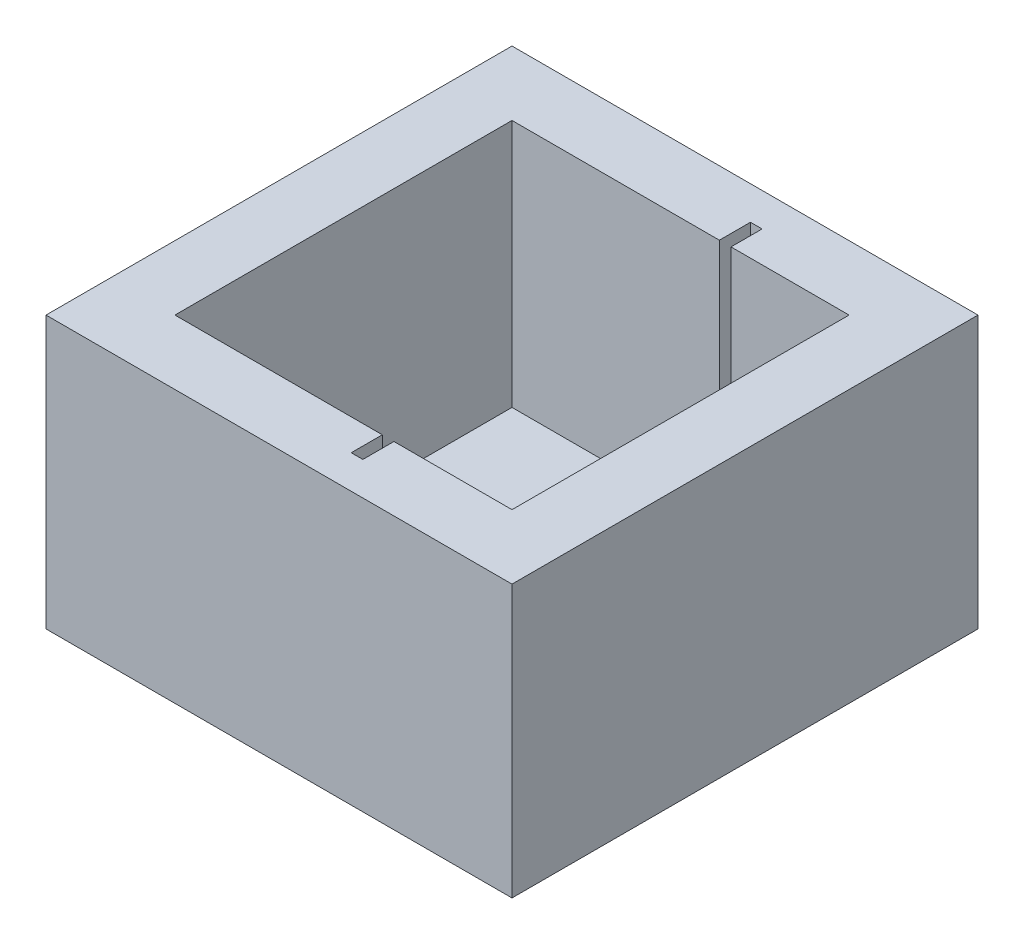
ISO-10303-21;
HEADER;
FILE_DESCRIPTION(('STEP AP214'),'2;1');
FILE_NAME('part.step','',(''),(''),'','','');
FILE_SCHEMA(('AUTOMOTIVE_DESIGN { 1 0 10303 214 1 1 1 1 }'));
ENDSEC;
DATA;
#1=APPLICATION_CONTEXT('core data for automotive mechanical design processes');
#2=APPLICATION_PROTOCOL_DEFINITION('international standard','automotive_design',2000,#1);
#3=PRODUCT_CONTEXT('',#1,'mechanical');
#4=PRODUCT('Part','Part','',(#3));
#5=PRODUCT_RELATED_PRODUCT_CATEGORY('part','',(#4));
#6=PRODUCT_DEFINITION_FORMATION('','',#4);
#7=PRODUCT_DEFINITION_CONTEXT('part definition',#1,'design');
#8=PRODUCT_DEFINITION('design','',#6,#7);
#9=PRODUCT_DEFINITION_SHAPE('','',#8);
#10=(LENGTH_UNIT() NAMED_UNIT(*) SI_UNIT(.MILLI.,.METRE.));
#11=(NAMED_UNIT(*) PLANE_ANGLE_UNIT() SI_UNIT($,.RADIAN.));
#12=(NAMED_UNIT(*) SI_UNIT($,.STERADIAN.) SOLID_ANGLE_UNIT());
#13=UNCERTAINTY_MEASURE_WITH_UNIT(LENGTH_MEASURE(1.E-05),#10,'distance_accuracy_value','');
#14=(GEOMETRIC_REPRESENTATION_CONTEXT(3) GLOBAL_UNCERTAINTY_ASSIGNED_CONTEXT((#13)) GLOBAL_UNIT_ASSIGNED_CONTEXT((#10,
#11,#12)) REPRESENTATION_CONTEXT('',''));
#15=CARTESIAN_POINT('',(0.,0.,0.));
#16=DIRECTION('',(0.,0.,1.));
#17=DIRECTION('',(1.,0.,0.));
#18=AXIS2_PLACEMENT_3D('',#15,#16,#17);
#19=CARTESIAN_POINT('',(0.,35.,0.));
#20=DIRECTION('',(0.,-1.,0.));
#21=DIRECTION('',(0.,0.,-1.));
#22=AXIS2_PLACEMENT_3D('',#19,#20,#21);
#23=PLANE('',#22);
#24=DIRECTION('',(1.,0.,0.));
#25=VECTOR('',#24,1.);
#26=CARTESIAN_POINT('',(-34.2654028436019,35.,41.303317535545));
#27=LINE('',#26,#25);
#28=CARTESIAN_POINT('',(-34.2654028436019,35.,41.303317535545));
#29=VERTEX_POINT('',#28);
#30=CARTESIAN_POINT('',(25.7345971563981,35.,41.303317535545));
#31=VERTEX_POINT('',#30);
#32=EDGE_CURVE('E197',#29,#31,#27,.T.);
#33=ORIENTED_EDGE('',*,*,#32,.T.);
#34=DIRECTION('',(0.,0.,1.));
#35=VECTOR('',#34,1.);
#36=CARTESIAN_POINT('',(25.7345971563981,35.,-18.696682464455));
#37=LINE('',#36,#35);
#38=CARTESIAN_POINT('',(25.7345971563981,35.,-18.696682464455));
#39=VERTEX_POINT('',#38);
#40=EDGE_CURVE('E199',#39,#31,#37,.T.);
#41=ORIENTED_EDGE('',*,*,#40,.F.);
#42=DIRECTION('',(1.,0.,0.));
#43=VECTOR('',#42,1.);
#44=CARTESIAN_POINT('',(-34.2654028436019,35.,-18.696682464455));
#45=LINE('',#44,#43);
#46=CARTESIAN_POINT('',(-34.2654028436019,35.,-18.696682464455));
#47=VERTEX_POINT('',#46);
#48=EDGE_CURVE('E203',#47,#39,#45,.T.);
#49=ORIENTED_EDGE('',*,*,#48,.F.);
#50=DIRECTION('',(0.,0.,1.));
#51=VECTOR('',#50,1.);
#52=CARTESIAN_POINT('',(-34.2654028436019,35.,-18.696682464455));
#53=LINE('',#52,#51);
#54=EDGE_CURVE('E206',#47,#29,#53,.T.);
#55=ORIENTED_EDGE('',*,*,#54,.T.);
#56=EDGE_LOOP('',(#33,#41,#49,#55));
#57=FACE_BOUND('',#56,.T.);
#58=DIRECTION('',(0.,0.,-1.));
#59=VECTOR('',#58,1.);
#60=CARTESIAN_POINT('',(2.23459715639813,35.,-14.396682464455));
#61=LINE('',#60,#59);
#62=CARTESIAN_POINT('',(2.23459715639813,35.,-10.396682464455));
#63=VERTEX_POINT('',#62);
#64=CARTESIAN_POINT('',(2.23459715639813,35.,-14.396682464455));
#65=VERTEX_POINT('',#64);
#66=EDGE_CURVE('E150',#63,#65,#61,.T.);
#67=ORIENTED_EDGE('',*,*,#66,.F.);
#68=DIRECTION('',(1.,0.,0.));
#69=VECTOR('',#68,1.);
#70=CARTESIAN_POINT('',(-25.9654028436019,35.,-10.396682464455));
#71=LINE('',#70,#69);
#72=CARTESIAN_POINT('',(17.4345971563981,35.,-10.396682464455));
#73=VERTEX_POINT('',#72);
#74=EDGE_CURVE('E162',#63,#73,#71,.T.);
#75=ORIENTED_EDGE('',*,*,#74,.T.);
#76=DIRECTION('',(0.,0.,1.));
#77=VECTOR('',#76,1.);
#78=CARTESIAN_POINT('',(17.4345971563981,35.,-10.396682464455));
#79=LINE('',#78,#77);
#80=CARTESIAN_POINT('',(17.4345971563981,35.,33.003317535545));
#81=VERTEX_POINT('',#80);
#82=EDGE_CURVE('E175',#73,#81,#79,.T.);
#83=ORIENTED_EDGE('',*,*,#82,.T.);
#84=DIRECTION('',(-1.,0.,0.));
#85=VECTOR('',#84,1.);
#86=CARTESIAN_POINT('',(17.4345971563981,35.,33.003317535545));
#87=LINE('',#86,#85);
#88=CARTESIAN_POINT('',(2.23459715639813,35.,33.003317535545));
#89=VERTEX_POINT('',#88);
#90=EDGE_CURVE('E182',#81,#89,#87,.T.);
#91=ORIENTED_EDGE('',*,*,#90,.T.);
#92=DIRECTION('',(0.,0.,-1.));
#93=VECTOR('',#92,1.);
#94=CARTESIAN_POINT('',(2.23459715639813,35.,33.003317535545));
#95=LINE('',#94,#93);
#96=CARTESIAN_POINT('',(2.23459715639813,35.,37.003317535545));
#97=VERTEX_POINT('',#96);
#98=EDGE_CURVE('E291',#97,#89,#95,.T.);
#99=ORIENTED_EDGE('',*,*,#98,.F.);
#100=DIRECTION('',(1.,0.,0.));
#101=VECTOR('',#100,1.);
#102=CARTESIAN_POINT('',(2.23459715639813,35.,37.003317535545));
#103=LINE('',#102,#101);
#104=CARTESIAN_POINT('',(0.734597156398127,35.,37.003317535545));
#105=VERTEX_POINT('',#104);
#106=EDGE_CURVE('E323',#105,#97,#103,.T.);
#107=ORIENTED_EDGE('',*,*,#106,.F.);
#108=DIRECTION('',(0.,0.,1.));
#109=VECTOR('',#108,1.);
#110=CARTESIAN_POINT('',(0.734597156398127,35.,37.003317535545));
#111=LINE('',#110,#109);
#112=CARTESIAN_POINT('',(0.734597156398127,35.,33.003317535545));
#113=VERTEX_POINT('',#112);
#114=EDGE_CURVE('E322',#113,#105,#111,.T.);
#115=ORIENTED_EDGE('',*,*,#114,.F.);
#116=CARTESIAN_POINT('',(-25.9654028436019,35.,33.003317535545));
#117=VERTEX_POINT('',#116);
#118=EDGE_CURVE('E181',#113,#117,#87,.T.);
#119=ORIENTED_EDGE('',*,*,#118,.T.);
#120=DIRECTION('',(0.,0.,-1.));
#121=VECTOR('',#120,1.);
#122=CARTESIAN_POINT('',(-25.9654028436019,35.,33.003317535545));
#123=LINE('',#122,#121);
#124=CARTESIAN_POINT('',(-25.9654028436019,35.,-10.396682464455));
#125=VERTEX_POINT('',#124);
#126=EDGE_CURVE('E156',#117,#125,#123,.T.);
#127=ORIENTED_EDGE('',*,*,#126,.T.);
#128=CARTESIAN_POINT('',(0.734597156398126,35.,-10.396682464455));
#129=VERTEX_POINT('',#128);
#130=EDGE_CURVE('E172',#125,#129,#71,.T.);
#131=ORIENTED_EDGE('',*,*,#130,.T.);
#132=DIRECTION('',(0.,0.,1.));
#133=VECTOR('',#132,1.);
#134=CARTESIAN_POINT('',(0.734597156398126,35.,-10.396682464455));
#135=LINE('',#134,#133);
#136=CARTESIAN_POINT('',(0.734597156398126,35.,-14.396682464455));
#137=VERTEX_POINT('',#136);
#138=EDGE_CURVE('E482',#137,#129,#135,.T.);
#139=ORIENTED_EDGE('',*,*,#138,.F.);
#140=DIRECTION('',(-1.,0.,0.));
#141=VECTOR('',#140,1.);
#142=CARTESIAN_POINT('',(0.734597156398126,35.,-14.396682464455));
#143=LINE('',#142,#141);
#144=EDGE_CURVE('E165',#65,#137,#143,.T.);
#145=ORIENTED_EDGE('',*,*,#144,.F.);
#146=EDGE_LOOP('',(#67,#75,#83,#91,#99,#107,#115,#119,#127,#131,#139,#145));
#147=FACE_BOUND('',#146,.T.);
#148=ADVANCED_FACE('F33',(#57,#147),#23,.F.);
#149=CARTESIAN_POINT('',(-25.9654028436019,3.,-10.396682464455));
#150=DIRECTION('',(0.,0.,1.));
#151=DIRECTION('',(1.,0.,0.));
#152=AXIS2_PLACEMENT_3D('',#149,#150,#151);
#153=PLANE('',#152);
#154=ORIENTED_EDGE('',*,*,#74,.F.);
#155=DIRECTION('',(0.,-1.,0.));
#156=VECTOR('',#155,1.);
#157=CARTESIAN_POINT('',(2.23459715639813,35.,-10.396682464455));
#158=LINE('',#157,#156);
#159=CARTESIAN_POINT('',(2.23459715639813,3.,-10.396682464455));
#160=VERTEX_POINT('',#159);
#161=EDGE_CURVE('E146',#63,#160,#158,.T.);
#162=ORIENTED_EDGE('',*,*,#161,.T.);
#163=DIRECTION('',(1.,0.,0.));
#164=VECTOR('',#163,1.);
#165=CARTESIAN_POINT('',(-25.9654028436019,3.,-10.396682464455));
#166=LINE('',#165,#164);
#167=CARTESIAN_POINT('',(17.4345971563981,3.,-10.396682464455));
#168=VERTEX_POINT('',#167);
#169=EDGE_CURVE('E307',#160,#168,#166,.T.);
#170=ORIENTED_EDGE('',*,*,#169,.T.);
#171=DIRECTION('',(0.,1.,0.));
#172=VECTOR('',#171,1.);
#173=CARTESIAN_POINT('',(17.4345971563981,3.,-10.396682464455));
#174=LINE('',#173,#172);
#175=EDGE_CURVE('E170',#168,#73,#174,.T.);
#176=ORIENTED_EDGE('',*,*,#175,.T.);
#177=EDGE_LOOP('',(#154,#162,#170,#176));
#178=FACE_BOUND('',#177,.T.);
#179=ADVANCED_FACE('F168',(#178),#153,.T.);
#180=CARTESIAN_POINT('',(-25.9654028436019,3.,-10.396682464455));
#181=VERTEX_POINT('',#180);
#182=CARTESIAN_POINT('',(0.734597156398127,3.,-10.396682464455));
#183=VERTEX_POINT('',#182);
#184=EDGE_CURVE('E308',#181,#183,#166,.T.);
#185=ORIENTED_EDGE('',*,*,#184,.T.);
#186=DIRECTION('',(0.,-1.,0.));
#187=VECTOR('',#186,1.);
#188=CARTESIAN_POINT('',(0.734597156398126,35.,-10.396682464455));
#189=LINE('',#188,#187);
#190=EDGE_CURVE('E48',#129,#183,#189,.T.);
#191=ORIENTED_EDGE('',*,*,#190,.F.);
#192=ORIENTED_EDGE('',*,*,#130,.F.);
#193=DIRECTION('',(0.,1.,0.));
#194=VECTOR('',#193,1.);
#195=CARTESIAN_POINT('',(-25.9654028436019,3.,-10.396682464455));
#196=LINE('',#195,#194);
#197=EDGE_CURVE('E193',#181,#125,#196,.T.);
#198=ORIENTED_EDGE('',*,*,#197,.F.);
#199=EDGE_LOOP('',(#185,#191,#192,#198));
#200=FACE_BOUND('',#199,.T.);
#201=ADVANCED_FACE('F246',(#200),#153,.T.);
#202=CARTESIAN_POINT('',(17.4345971563981,3.,33.003317535545));
#203=DIRECTION('',(0.,0.,-1.));
#204=DIRECTION('',(-1.,0.,0.));
#205=AXIS2_PLACEMENT_3D('',#202,#203,#204);
#206=PLANE('',#205);
#207=ORIENTED_EDGE('',*,*,#118,.F.);
#208=DIRECTION('',(0.,-1.,0.));
#209=VECTOR('',#208,1.);
#210=CARTESIAN_POINT('',(0.734597156398127,35.,33.003317535545));
#211=LINE('',#210,#209);
#212=CARTESIAN_POINT('',(0.734597156398127,3.,33.003317535545));
#213=VERTEX_POINT('',#212);
#214=EDGE_CURVE('E294',#113,#213,#211,.T.);
#215=ORIENTED_EDGE('',*,*,#214,.T.);
#216=DIRECTION('',(-1.,0.,0.));
#217=VECTOR('',#216,1.);
#218=CARTESIAN_POINT('',(17.4345971563981,3.,33.003317535545));
#219=LINE('',#218,#217);
#220=CARTESIAN_POINT('',(-25.9654028436019,3.,33.003317535545));
#221=VERTEX_POINT('',#220);
#222=EDGE_CURVE('E312',#213,#221,#219,.T.);
#223=ORIENTED_EDGE('',*,*,#222,.T.);
#224=DIRECTION('',(0.,1.,0.));
#225=VECTOR('',#224,1.);
#226=CARTESIAN_POINT('',(-25.9654028436019,3.,33.003317535545));
#227=LINE('',#226,#225);
#228=EDGE_CURVE('E186',#221,#117,#227,.T.);
#229=ORIENTED_EDGE('',*,*,#228,.T.);
#230=EDGE_LOOP('',(#207,#215,#223,#229));
#231=FACE_BOUND('',#230,.T.);
#232=ADVANCED_FACE('F264',(#231),#206,.T.);
#233=CARTESIAN_POINT('',(17.4345971563981,3.,33.003317535545));
#234=VERTEX_POINT('',#233);
#235=CARTESIAN_POINT('',(2.23459715639813,3.,33.003317535545));
#236=VERTEX_POINT('',#235);
#237=EDGE_CURVE('E190',#234,#236,#219,.T.);
#238=ORIENTED_EDGE('',*,*,#237,.T.);
#239=DIRECTION('',(0.,-1.,0.));
#240=VECTOR('',#239,1.);
#241=CARTESIAN_POINT('',(2.23459715639813,35.,33.003317535545));
#242=LINE('',#241,#240);
#243=EDGE_CURVE('E56',#89,#236,#242,.T.);
#244=ORIENTED_EDGE('',*,*,#243,.F.);
#245=ORIENTED_EDGE('',*,*,#90,.F.);
#246=DIRECTION('',(0.,1.,0.));
#247=VECTOR('',#246,1.);
#248=CARTESIAN_POINT('',(17.4345971563981,3.,33.003317535545));
#249=LINE('',#248,#247);
#250=EDGE_CURVE('E189',#234,#81,#249,.T.);
#251=ORIENTED_EDGE('',*,*,#250,.F.);
#252=EDGE_LOOP('',(#238,#244,#245,#251));
#253=FACE_BOUND('',#252,.T.);
#254=ADVANCED_FACE('F260',(#253),#206,.T.);
#255=CARTESIAN_POINT('',(-34.2654028436019,35.,41.303317535545));
#256=DIRECTION('',(0.,0.,-1.));
#257=DIRECTION('',(-1.,0.,0.));
#258=AXIS2_PLACEMENT_3D('',#255,#256,#257);
#259=PLANE('',#258);
#260=DIRECTION('',(1.,0.,0.));
#261=VECTOR('',#260,1.);
#262=CARTESIAN_POINT('',(-34.2654028436019,0.,41.303317535545));
#263=LINE('',#262,#261);
#264=CARTESIAN_POINT('',(-34.2654028436019,0.,41.303317535545));
#265=VERTEX_POINT('',#264);
#266=CARTESIAN_POINT('',(25.7345971563981,0.,41.303317535545));
#267=VERTEX_POINT('',#266);
#268=EDGE_CURVE('E196',#265,#267,#263,.T.);
#269=ORIENTED_EDGE('',*,*,#268,.T.);
#270=DIRECTION('',(0.,-1.,0.));
#271=VECTOR('',#270,1.);
#272=CARTESIAN_POINT('',(25.7345971563981,35.,41.303317535545));
#273=LINE('',#272,#271);
#274=EDGE_CURVE('E11',#31,#267,#273,.T.);
#275=ORIENTED_EDGE('',*,*,#274,.F.);
#276=ORIENTED_EDGE('',*,*,#32,.F.);
#277=DIRECTION('',(0.,-1.,0.));
#278=VECTOR('',#277,1.);
#279=CARTESIAN_POINT('',(-34.2654028436019,35.,41.303317535545));
#280=LINE('',#279,#278);
#281=EDGE_CURVE('E208',#29,#265,#280,.T.);
#282=ORIENTED_EDGE('',*,*,#281,.T.);
#283=EDGE_LOOP('',(#269,#275,#276,#282));
#284=FACE_BOUND('',#283,.T.);
#285=ADVANCED_FACE('F35',(#284),#259,.F.);
#286=CARTESIAN_POINT('',(25.7345971563981,35.,-18.696682464455));
#287=DIRECTION('',(1.,0.,0.));
#288=DIRECTION('',(0.,0.,-1.));
#289=AXIS2_PLACEMENT_3D('',#286,#287,#288);
#290=PLANE('',#289);
#291=DIRECTION('',(0.,0.,1.));
#292=VECTOR('',#291,1.);
#293=CARTESIAN_POINT('',(25.7345971563981,0.,-18.696682464455));
#294=LINE('',#293,#292);
#295=CARTESIAN_POINT('',(25.7345971563981,0.,-18.696682464455));
#296=VERTEX_POINT('',#295);
#297=EDGE_CURVE('E211',#296,#267,#294,.T.);
#298=ORIENTED_EDGE('',*,*,#297,.F.);
#299=DIRECTION('',(0.,-1.,0.));
#300=VECTOR('',#299,1.);
#301=CARTESIAN_POINT('',(25.7345971563981,35.,-18.696682464455));
#302=LINE('',#301,#300);
#303=EDGE_CURVE('E41',#39,#296,#302,.T.);
#304=ORIENTED_EDGE('',*,*,#303,.F.);
#305=ORIENTED_EDGE('',*,*,#40,.T.);
#306=ORIENTED_EDGE('',*,*,#274,.T.);
#307=EDGE_LOOP('',(#298,#304,#305,#306));
#308=FACE_BOUND('',#307,.T.);
#309=ADVANCED_FACE('F228',(#308),#290,.T.);
#310=CARTESIAN_POINT('',(-34.2654028436019,35.,-18.696682464455));
#311=DIRECTION('',(0.,0.,-1.));
#312=DIRECTION('',(-1.,0.,0.));
#313=AXIS2_PLACEMENT_3D('',#310,#311,#312);
#314=PLANE('',#313);
#315=DIRECTION('',(1.,0.,0.));
#316=VECTOR('',#315,1.);
#317=CARTESIAN_POINT('',(-34.2654028436019,0.,-18.696682464455));
#318=LINE('',#317,#316);
#319=CARTESIAN_POINT('',(-34.2654028436019,0.,-18.696682464455));
#320=VERTEX_POINT('',#319);
#321=EDGE_CURVE('E214',#320,#296,#318,.T.);
#322=ORIENTED_EDGE('',*,*,#321,.F.);
#323=DIRECTION('',(0.,-1.,0.));
#324=VECTOR('',#323,1.);
#325=CARTESIAN_POINT('',(-34.2654028436019,35.,-18.696682464455));
#326=LINE('',#325,#324);
#327=EDGE_CURVE('E220',#47,#320,#326,.T.);
#328=ORIENTED_EDGE('',*,*,#327,.F.);
#329=ORIENTED_EDGE('',*,*,#48,.T.);
#330=ORIENTED_EDGE('',*,*,#303,.T.);
#331=EDGE_LOOP('',(#322,#328,#329,#330));
#332=FACE_BOUND('',#331,.T.);
#333=ADVANCED_FACE('F224',(#332),#314,.T.);
#334=CARTESIAN_POINT('',(-34.2654028436019,35.,-18.696682464455));
#335=DIRECTION('',(1.,0.,0.));
#336=DIRECTION('',(0.,0.,-1.));
#337=AXIS2_PLACEMENT_3D('',#334,#335,#336);
#338=PLANE('',#337);
#339=DIRECTION('',(0.,0.,1.));
#340=VECTOR('',#339,1.);
#341=CARTESIAN_POINT('',(-34.2654028436019,0.,-18.696682464455));
#342=LINE('',#341,#340);
#343=EDGE_CURVE('E200',#320,#265,#342,.T.);
#344=ORIENTED_EDGE('',*,*,#343,.T.);
#345=ORIENTED_EDGE('',*,*,#281,.F.);
#346=ORIENTED_EDGE('',*,*,#54,.F.);
#347=ORIENTED_EDGE('',*,*,#327,.T.);
#348=EDGE_LOOP('',(#344,#345,#346,#347));
#349=FACE_BOUND('',#348,.T.);
#350=ADVANCED_FACE('F236',(#349),#338,.F.);
#351=CARTESIAN_POINT('',(0.,0.,0.));
#352=DIRECTION('',(0.,-1.,0.));
#353=DIRECTION('',(0.,0.,-1.));
#354=AXIS2_PLACEMENT_3D('',#351,#352,#353);
#355=PLANE('',#354);
#356=ORIENTED_EDGE('',*,*,#268,.F.);
#357=ORIENTED_EDGE('',*,*,#343,.F.);
#358=ORIENTED_EDGE('',*,*,#321,.T.);
#359=ORIENTED_EDGE('',*,*,#297,.T.);
#360=EDGE_LOOP('',(#356,#357,#358,#359));
#361=FACE_BOUND('',#360,.T.);
#362=ADVANCED_FACE('F233',(#361),#355,.T.);
#363=CARTESIAN_POINT('',(-25.9654028436019,3.,33.003317535545));
#364=DIRECTION('',(1.,0.,0.));
#365=DIRECTION('',(0.,0.,-1.));
#366=AXIS2_PLACEMENT_3D('',#363,#364,#365);
#367=PLANE('',#366);
#368=ORIENTED_EDGE('',*,*,#126,.F.);
#369=ORIENTED_EDGE('',*,*,#228,.F.);
#370=DIRECTION('',(0.,0.,-1.));
#371=VECTOR('',#370,1.);
#372=CARTESIAN_POINT('',(-25.9654028436019,3.,33.003317535545));
#373=LINE('',#372,#371);
#374=EDGE_CURVE('E185',#221,#181,#373,.T.);
#375=ORIENTED_EDGE('',*,*,#374,.T.);
#376=ORIENTED_EDGE('',*,*,#197,.T.);
#377=EDGE_LOOP('',(#368,#369,#375,#376));
#378=FACE_BOUND('',#377,.T.);
#379=ADVANCED_FACE('F250',(#378),#367,.T.);
#380=CARTESIAN_POINT('',(17.4345971563981,3.,-10.396682464455));
#381=DIRECTION('',(-1.,0.,0.));
#382=DIRECTION('',(0.,0.,1.));
#383=AXIS2_PLACEMENT_3D('',#380,#381,#382);
#384=PLANE('',#383);
#385=ORIENTED_EDGE('',*,*,#82,.F.);
#386=ORIENTED_EDGE('',*,*,#175,.F.);
#387=DIRECTION('',(0.,0.,1.));
#388=VECTOR('',#387,1.);
#389=CARTESIAN_POINT('',(17.4345971563981,3.,-10.396682464455));
#390=LINE('',#389,#388);
#391=EDGE_CURVE('E311',#168,#234,#390,.T.);
#392=ORIENTED_EDGE('',*,*,#391,.T.);
#393=ORIENTED_EDGE('',*,*,#250,.T.);
#394=EDGE_LOOP('',(#385,#386,#392,#393));
#395=FACE_BOUND('',#394,.T.);
#396=ADVANCED_FACE('F276',(#395),#384,.T.);
#397=CARTESIAN_POINT('',(0.,3.,0.));
#398=DIRECTION('',(0.,-1.,0.));
#399=DIRECTION('',(0.,0.,-1.));
#400=AXIS2_PLACEMENT_3D('',#397,#398,#399);
#401=PLANE('',#400);
#402=ORIENTED_EDGE('',*,*,#374,.F.);
#403=ORIENTED_EDGE('',*,*,#222,.F.);
#404=DIRECTION('',(0.,0.,1.));
#405=VECTOR('',#404,1.);
#406=CARTESIAN_POINT('',(0.734597156398127,3.,37.003317535545));
#407=LINE('',#406,#405);
#408=CARTESIAN_POINT('',(0.734597156398127,3.,37.003317535545));
#409=VERTEX_POINT('',#408);
#410=EDGE_CURVE('E333',#213,#409,#407,.T.);
#411=ORIENTED_EDGE('',*,*,#410,.T.);
#412=DIRECTION('',(1.,0.,0.));
#413=VECTOR('',#412,1.);
#414=CARTESIAN_POINT('',(2.23459715639813,3.,37.003317535545));
#415=LINE('',#414,#413);
#416=CARTESIAN_POINT('',(2.23459715639813,3.,37.003317535545));
#417=VERTEX_POINT('',#416);
#418=EDGE_CURVE('E329',#409,#417,#415,.T.);
#419=ORIENTED_EDGE('',*,*,#418,.T.);
#420=DIRECTION('',(0.,0.,-1.));
#421=VECTOR('',#420,1.);
#422=CARTESIAN_POINT('',(2.23459715639813,3.,33.003317535545));
#423=LINE('',#422,#421);
#424=EDGE_CURVE('E326',#417,#236,#423,.T.);
#425=ORIENTED_EDGE('',*,*,#424,.T.);
#426=ORIENTED_EDGE('',*,*,#237,.F.);
#427=ORIENTED_EDGE('',*,*,#391,.F.);
#428=ORIENTED_EDGE('',*,*,#169,.F.);
#429=DIRECTION('',(0.,0.,-1.));
#430=VECTOR('',#429,1.);
#431=CARTESIAN_POINT('',(2.23459715639813,3.,-14.396682464455));
#432=LINE('',#431,#430);
#433=CARTESIAN_POINT('',(2.23459715639813,3.,-14.396682464455));
#434=VERTEX_POINT('',#433);
#435=EDGE_CURVE('E152',#160,#434,#432,.T.);
#436=ORIENTED_EDGE('',*,*,#435,.T.);
#437=DIRECTION('',(-1.,0.,0.));
#438=VECTOR('',#437,1.);
#439=CARTESIAN_POINT('',(0.734597156398126,3.,-14.396682464455));
#440=LINE('',#439,#438);
#441=CARTESIAN_POINT('',(0.734597156398126,3.,-14.396682464455));
#442=VERTEX_POINT('',#441);
#443=EDGE_CURVE('E476',#434,#442,#440,.T.);
#444=ORIENTED_EDGE('',*,*,#443,.T.);
#445=DIRECTION('',(0.,0.,1.));
#446=VECTOR('',#445,1.);
#447=CARTESIAN_POINT('',(0.734597156398126,3.,-10.396682464455));
#448=LINE('',#447,#446);
#449=EDGE_CURVE('E166',#442,#183,#448,.T.);
#450=ORIENTED_EDGE('',*,*,#449,.T.);
#451=ORIENTED_EDGE('',*,*,#184,.F.);
#452=EDGE_LOOP('',(#402,#403,#411,#419,#425,#426,#427,#428,#436,#444,#450,#451));
#453=FACE_BOUND('',#452,.T.);
#454=ADVANCED_FACE('F274',(#453),#401,.F.);
#455=CARTESIAN_POINT('',(0.734597156398127,35.,37.003317535545));
#456=DIRECTION('',(1.,0.,0.));
#457=DIRECTION('',(0.,0.,-1.));
#458=AXIS2_PLACEMENT_3D('',#455,#456,#457);
#459=PLANE('',#458);
#460=ORIENTED_EDGE('',*,*,#410,.F.);
#461=ORIENTED_EDGE('',*,*,#214,.F.);
#462=ORIENTED_EDGE('',*,*,#114,.T.);
#463=DIRECTION('',(0.,-1.,0.));
#464=VECTOR('',#463,1.);
#465=CARTESIAN_POINT('',(0.734597156398127,35.,37.003317535545));
#466=LINE('',#465,#464);
#467=EDGE_CURVE('E297',#105,#409,#466,.T.);
#468=ORIENTED_EDGE('',*,*,#467,.T.);
#469=EDGE_LOOP('',(#460,#461,#462,#468));
#470=FACE_BOUND('',#469,.T.);
#471=ADVANCED_FACE('F283',(#470),#459,.T.);
#472=CARTESIAN_POINT('',(2.23459715639813,35.,37.003317535545));
#473=DIRECTION('',(0.,0.,-1.));
#474=DIRECTION('',(-1.,0.,0.));
#475=AXIS2_PLACEMENT_3D('',#472,#473,#474);
#476=PLANE('',#475);
#477=ORIENTED_EDGE('',*,*,#418,.F.);
#478=ORIENTED_EDGE('',*,*,#467,.F.);
#479=ORIENTED_EDGE('',*,*,#106,.T.);
#480=DIRECTION('',(0.,-1.,0.));
#481=VECTOR('',#480,1.);
#482=CARTESIAN_POINT('',(2.23459715639813,35.,37.003317535545));
#483=LINE('',#482,#481);
#484=EDGE_CURVE('E293',#97,#417,#483,.T.);
#485=ORIENTED_EDGE('',*,*,#484,.T.);
#486=EDGE_LOOP('',(#477,#478,#479,#485));
#487=FACE_BOUND('',#486,.T.);
#488=ADVANCED_FACE('F337',(#487),#476,.T.);
#489=CARTESIAN_POINT('',(2.23459715639813,35.,33.003317535545));
#490=DIRECTION('',(-1.,0.,0.));
#491=DIRECTION('',(0.,0.,1.));
#492=AXIS2_PLACEMENT_3D('',#489,#490,#491);
#493=PLANE('',#492);
#494=ORIENTED_EDGE('',*,*,#424,.F.);
#495=ORIENTED_EDGE('',*,*,#484,.F.);
#496=ORIENTED_EDGE('',*,*,#98,.T.);
#497=ORIENTED_EDGE('',*,*,#243,.T.);
#498=EDGE_LOOP('',(#494,#495,#496,#497));
#499=FACE_BOUND('',#498,.T.);
#500=ADVANCED_FACE('F338',(#499),#493,.T.);
#501=CARTESIAN_POINT('',(2.23459715639813,35.,-14.396682464455));
#502=DIRECTION('',(-1.,0.,0.));
#503=DIRECTION('',(0.,0.,1.));
#504=AXIS2_PLACEMENT_3D('',#501,#502,#503);
#505=PLANE('',#504);
#506=ORIENTED_EDGE('',*,*,#435,.F.);
#507=ORIENTED_EDGE('',*,*,#161,.F.);
#508=ORIENTED_EDGE('',*,*,#66,.T.);
#509=DIRECTION('',(0.,-1.,0.));
#510=VECTOR('',#509,1.);
#511=CARTESIAN_POINT('',(2.23459715639813,35.,-14.396682464455));
#512=LINE('',#511,#510);
#513=EDGE_CURVE('E157',#65,#434,#512,.T.);
#514=ORIENTED_EDGE('',*,*,#513,.T.);
#515=EDGE_LOOP('',(#506,#507,#508,#514));
#516=FACE_BOUND('',#515,.T.);
#517=ADVANCED_FACE('F148',(#516),#505,.T.);
#518=CARTESIAN_POINT('',(0.734597156398126,35.,-14.396682464455));
#519=DIRECTION('',(0.,0.,1.));
#520=DIRECTION('',(1.,0.,0.));
#521=AXIS2_PLACEMENT_3D('',#518,#519,#520);
#522=PLANE('',#521);
#523=ORIENTED_EDGE('',*,*,#443,.F.);
#524=ORIENTED_EDGE('',*,*,#513,.F.);
#525=ORIENTED_EDGE('',*,*,#144,.T.);
#526=DIRECTION('',(0.,-1.,0.));
#527=VECTOR('',#526,1.);
#528=CARTESIAN_POINT('',(0.734597156398126,35.,-14.396682464455));
#529=LINE('',#528,#527);
#530=EDGE_CURVE('E475',#137,#442,#529,.T.);
#531=ORIENTED_EDGE('',*,*,#530,.T.);
#532=EDGE_LOOP('',(#523,#524,#525,#531));
#533=FACE_BOUND('',#532,.T.);
#534=ADVANCED_FACE('F345',(#533),#522,.T.);
#535=CARTESIAN_POINT('',(0.734597156398126,35.,-10.396682464455));
#536=DIRECTION('',(1.,0.,0.));
#537=DIRECTION('',(0.,0.,-1.));
#538=AXIS2_PLACEMENT_3D('',#535,#536,#537);
#539=PLANE('',#538);
#540=ORIENTED_EDGE('',*,*,#449,.F.);
#541=ORIENTED_EDGE('',*,*,#530,.F.);
#542=ORIENTED_EDGE('',*,*,#138,.T.);
#543=ORIENTED_EDGE('',*,*,#190,.T.);
#544=EDGE_LOOP('',(#540,#541,#542,#543));
#545=FACE_BOUND('',#544,.T.);
#546=ADVANCED_FACE('F377',(#545),#539,.T.);
#547=CLOSED_SHELL('',(#148,#179,#201,#232,#254,#285,#309,#333,#350,#362,#379,#396,#454,#471,
#488,#500,#517,#534,#546));
#548=MANIFOLD_SOLID_BREP('B2',#547);
#549=ADVANCED_BREP_SHAPE_REPRESENTATION('',(#18,#548),#14);
#550=SHAPE_DEFINITION_REPRESENTATION(#9,#549);
ENDSEC;
END-ISO-10303-21;
